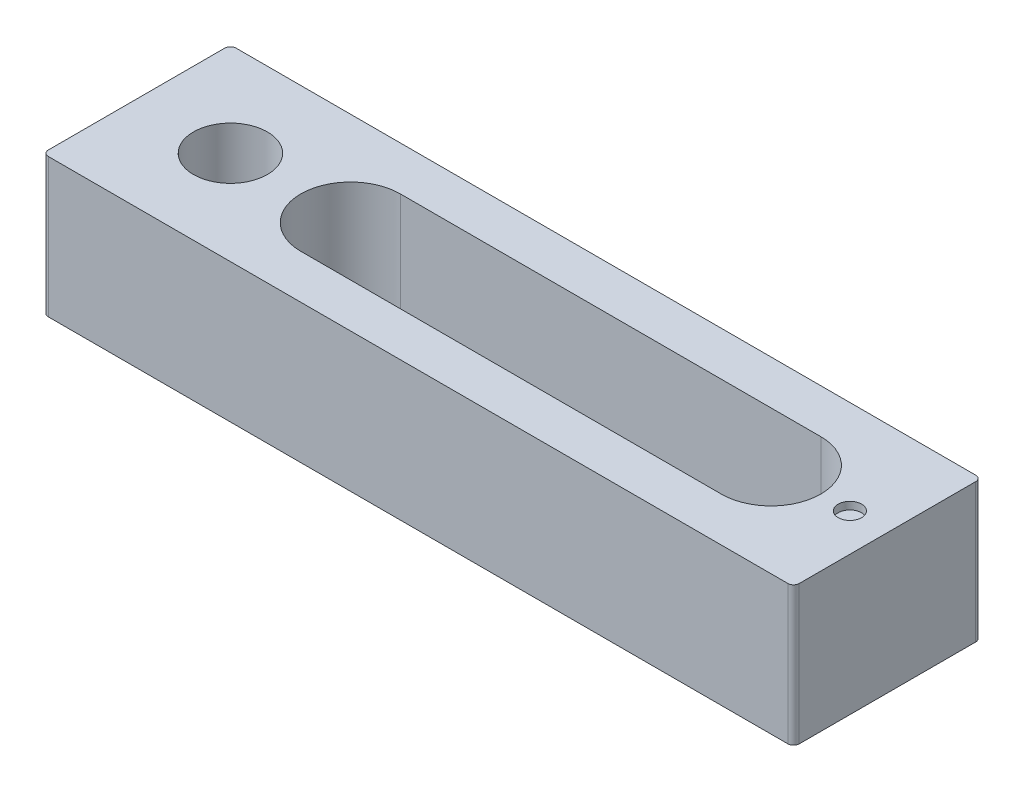
ISO-10303-21;
HEADER;
FILE_DESCRIPTION(('STEP AP214'),'2;1');
FILE_NAME('part.step','',(''),(''),'','','');
FILE_SCHEMA(('AUTOMOTIVE_DESIGN { 1 0 10303 214 1 1 1 1 }'));
ENDSEC;
DATA;
#1=APPLICATION_CONTEXT('core data for automotive mechanical design processes');
#2=APPLICATION_PROTOCOL_DEFINITION('international standard','automotive_design',2000,#1);
#3=PRODUCT_CONTEXT('',#1,'mechanical');
#4=PRODUCT('Part','Part','',(#3));
#5=PRODUCT_RELATED_PRODUCT_CATEGORY('part','',(#4));
#6=PRODUCT_DEFINITION_FORMATION('','',#4);
#7=PRODUCT_DEFINITION_CONTEXT('part definition',#1,'design');
#8=PRODUCT_DEFINITION('design','',#6,#7);
#9=PRODUCT_DEFINITION_SHAPE('','',#8);
#10=(LENGTH_UNIT() NAMED_UNIT(*) SI_UNIT(.MILLI.,.METRE.));
#11=(NAMED_UNIT(*) PLANE_ANGLE_UNIT() SI_UNIT($,.RADIAN.));
#12=(NAMED_UNIT(*) SI_UNIT($,.STERADIAN.) SOLID_ANGLE_UNIT());
#13=UNCERTAINTY_MEASURE_WITH_UNIT(LENGTH_MEASURE(1.E-05),#10,'distance_accuracy_value','');
#14=(GEOMETRIC_REPRESENTATION_CONTEXT(3) GLOBAL_UNCERTAINTY_ASSIGNED_CONTEXT((#13)) GLOBAL_UNIT_ASSIGNED_CONTEXT((#10,
#11,#12)) REPRESENTATION_CONTEXT('',''));
#15=CARTESIAN_POINT('',(0.,0.,0.));
#16=DIRECTION('',(0.,0.,1.));
#17=DIRECTION('',(1.,0.,0.));
#18=AXIS2_PLACEMENT_3D('',#15,#16,#17);
#19=CARTESIAN_POINT('',(-26.668802084728,5.51117500741104,-5.65020163902085));
#20=DIRECTION('',(0.,1.,0.));
#21=DIRECTION('',(0.,0.,1.));
#22=AXIS2_PLACEMENT_3D('',#19,#20,#21);
#23=PLANE('',#22);
#24=CARTESIAN_POINT('',(21.210197915272,5.51117500741104,0.318798360979145));
#25=DIRECTION('',(0.,1.,0.));
#26=DIRECTION('',(0.,0.,1.));
#27=AXIS2_PLACEMENT_3D('',#24,#25,#26);
#28=CIRCLE('',#27,0.793749999999999);
#29=CARTESIAN_POINT('',(21.210197915272,5.51117500741104,1.11254836097914));
#30=VERTEX_POINT('',#29);
#31=EDGE_CURVE('E291',#30,#30,#28,.T.);
#32=ORIENTED_EDGE('',*,*,#31,.F.);
#33=EDGE_LOOP('',(#32));
#34=FACE_BOUND('',#33,.T.);
#35=CARTESIAN_POINT('',(-20.699802084728,5.51117500741104,0.318798360979144));
#36=DIRECTION('',(0.,1.,0.));
#37=DIRECTION('',(0.,0.,1.));
#38=AXIS2_PLACEMENT_3D('',#35,#36,#37);
#39=CIRCLE('',#38,2.5);
#40=CARTESIAN_POINT('',(-20.699802084728,5.51117500741104,2.81879836097914));
#41=VERTEX_POINT('',#40);
#42=EDGE_CURVE('E133',#41,#41,#39,.T.);
#43=ORIENTED_EDGE('',*,*,#42,.F.);
#44=EDGE_LOOP('',(#43));
#45=FACE_BOUND('',#44,.T.);
#46=CARTESIAN_POINT('',(-26.668802084728,5.51117500741104,-5.65020163902085));
#47=DIRECTION('',(0.,1.,0.));
#48=DIRECTION('',(0.,0.,1.));
#49=AXIS2_PLACEMENT_3D('',#46,#47,#48);
#50=CIRCLE('',#49,0.381);
#51=CARTESIAN_POINT('',(-26.668802084728,5.51117500741104,-6.03120163902086));
#52=VERTEX_POINT('',#51);
#53=CARTESIAN_POINT('',(-27.049802084728,5.51117500741104,-5.65020163902085));
#54=VERTEX_POINT('',#53);
#55=EDGE_CURVE('E143',#52,#54,#50,.T.);
#56=ORIENTED_EDGE('',*,*,#55,.T.);
#57=DIRECTION('',(0.,0.,1.));
#58=VECTOR('',#57,1.);
#59=CARTESIAN_POINT('',(-27.049802084728,5.51117500741104,-5.65020163902085));
#60=LINE('',#59,#58);
#61=CARTESIAN_POINT('',(-27.049802084728,5.51117500741104,6.28779836097914));
#62=VERTEX_POINT('',#61);
#63=EDGE_CURVE('E146',#54,#62,#60,.T.);
#64=ORIENTED_EDGE('',*,*,#63,.T.);
#65=CARTESIAN_POINT('',(-26.668802084728,5.51117500741104,6.28779836097914));
#66=DIRECTION('',(0.,1.,0.));
#67=DIRECTION('',(0.,0.,1.));
#68=AXIS2_PLACEMENT_3D('',#65,#66,#67);
#69=CIRCLE('',#68,0.381);
#70=CARTESIAN_POINT('',(-26.668802084728,5.51117500741104,6.66879836097914));
#71=VERTEX_POINT('',#70);
#72=EDGE_CURVE('E149',#62,#71,#69,.T.);
#73=ORIENTED_EDGE('',*,*,#72,.T.);
#74=DIRECTION('',(1.,0.,0.));
#75=VECTOR('',#74,1.);
#76=CARTESIAN_POINT('',(-26.668802084728,5.51117500741104,6.66879836097914));
#77=LINE('',#76,#75);
#78=CARTESIAN_POINT('',(23.369197915272,5.51117500741104,6.66879836097914));
#79=VERTEX_POINT('',#78);
#80=EDGE_CURVE('E151',#71,#79,#77,.T.);
#81=ORIENTED_EDGE('',*,*,#80,.T.);
#82=CARTESIAN_POINT('',(23.369197915272,5.51117500741104,6.28779836097914));
#83=DIRECTION('',(0.,1.,0.));
#84=DIRECTION('',(0.,0.,1.));
#85=AXIS2_PLACEMENT_3D('',#82,#83,#84);
#86=CIRCLE('',#85,0.381);
#87=CARTESIAN_POINT('',(23.750197915272,5.51117500741104,6.28779836097914));
#88=VERTEX_POINT('',#87);
#89=EDGE_CURVE('E153',#79,#88,#86,.T.);
#90=ORIENTED_EDGE('',*,*,#89,.T.);
#91=DIRECTION('',(0.,0.,-1.));
#92=VECTOR('',#91,1.);
#93=CARTESIAN_POINT('',(23.750197915272,5.51117500741104,-5.65020163902085));
#94=LINE('',#93,#92);
#95=CARTESIAN_POINT('',(23.750197915272,5.51117500741104,-5.65020163902085));
#96=VERTEX_POINT('',#95);
#97=EDGE_CURVE('E155',#88,#96,#94,.T.);
#98=ORIENTED_EDGE('',*,*,#97,.T.);
#99=CARTESIAN_POINT('',(23.369197915272,5.51117500741104,-5.65020163902085));
#100=DIRECTION('',(0.,1.,0.));
#101=DIRECTION('',(0.,0.,-1.));
#102=AXIS2_PLACEMENT_3D('',#99,#100,#101);
#103=CIRCLE('',#102,0.381);
#104=CARTESIAN_POINT('',(23.369197915272,5.51117500741104,-6.03120163902085));
#105=VERTEX_POINT('',#104);
#106=EDGE_CURVE('E157',#96,#105,#103,.T.);
#107=ORIENTED_EDGE('',*,*,#106,.T.);
#108=DIRECTION('',(-1.,0.,0.));
#109=VECTOR('',#108,1.);
#110=CARTESIAN_POINT('',(-26.668802084728,5.51117500741104,-6.03120163902086));
#111=LINE('',#110,#109);
#112=EDGE_CURVE('E159',#105,#52,#111,.T.);
#113=ORIENTED_EDGE('',*,*,#112,.T.);
#114=EDGE_LOOP('',(#56,#64,#73,#81,#90,#98,#107,#113));
#115=FACE_BOUND('',#114,.T.);
#116=DIRECTION('',(1.,0.,0.));
#117=VECTOR('',#116,1.);
#118=CARTESIAN_POINT('',(-12.571802084728,5.51117500741104,3.68429836097914));
#119=LINE('',#118,#117);
#120=CARTESIAN_POINT('',(-12.571802084728,5.51117500741104,3.68429836097914));
#121=VERTEX_POINT('',#120);
#122=CARTESIAN_POINT('',(15.876197915272,5.51117500741104,3.68429836097914));
#123=VERTEX_POINT('',#122);
#124=EDGE_CURVE('E113',#121,#123,#119,.T.);
#125=ORIENTED_EDGE('',*,*,#124,.F.);
#126=CARTESIAN_POINT('',(-12.571802084728,5.51117500741104,0.318798360979144));
#127=DIRECTION('',(0.,1.,0.));
#128=DIRECTION('',(0.,0.,1.));
#129=AXIS2_PLACEMENT_3D('',#126,#127,#128);
#130=CIRCLE('',#129,3.3655);
#131=CARTESIAN_POINT('',(-12.571802084728,5.51117500741104,-3.04670163902086));
#132=VERTEX_POINT('',#131);
#133=EDGE_CURVE('E105',#132,#121,#130,.T.);
#134=ORIENTED_EDGE('',*,*,#133,.F.);
#135=DIRECTION('',(-1.,0.,0.));
#136=VECTOR('',#135,1.);
#137=CARTESIAN_POINT('',(-12.571802084728,5.51117500741104,-3.04670163902086));
#138=LINE('',#137,#136);
#139=CARTESIAN_POINT('',(15.876197915272,5.51117500741104,-3.04670163902086));
#140=VERTEX_POINT('',#139);
#141=EDGE_CURVE('E127',#140,#132,#138,.T.);
#142=ORIENTED_EDGE('',*,*,#141,.F.);
#143=CARTESIAN_POINT('',(15.876197915272,5.51117500741104,0.318798360979144));
#144=DIRECTION('',(0.,1.,0.));
#145=DIRECTION('',(0.,0.,1.));
#146=AXIS2_PLACEMENT_3D('',#143,#144,#145);
#147=CIRCLE('',#146,3.3655);
#148=EDGE_CURVE('E125',#123,#140,#147,.T.);
#149=ORIENTED_EDGE('',*,*,#148,.F.);
#150=EDGE_LOOP('',(#125,#134,#142,#149));
#151=FACE_BOUND('',#150,.T.);
#152=ADVANCED_FACE('F16',(#34,#45,#115,#151),#23,.T.);
#153=CARTESIAN_POINT('',(-26.668802084728,-3.88682499258896,-5.65020163902085));
#154=DIRECTION('',(0.,1.,0.));
#155=DIRECTION('',(0.,0.,1.));
#156=AXIS2_PLACEMENT_3D('',#153,#154,#155);
#157=PLANE('',#156);
#158=CARTESIAN_POINT('',(-20.699802084728,-3.88682499258896,0.318798360979144));
#159=DIRECTION('',(0.,1.,0.));
#160=DIRECTION('',(0.,0.,1.));
#161=AXIS2_PLACEMENT_3D('',#158,#159,#160);
#162=CIRCLE('',#161,2.5);
#163=CARTESIAN_POINT('',(-20.699802084728,-3.88682499258896,2.81879836097914));
#164=VERTEX_POINT('',#163);
#165=EDGE_CURVE('E290',#164,#164,#162,.T.);
#166=ORIENTED_EDGE('',*,*,#165,.T.);
#167=EDGE_LOOP('',(#166));
#168=FACE_BOUND('',#167,.T.);
#169=CARTESIAN_POINT('',(-26.668802084728,-3.88682499258896,-5.65020163902085));
#170=DIRECTION('',(0.,1.,0.));
#171=DIRECTION('',(0.,0.,1.));
#172=AXIS2_PLACEMENT_3D('',#169,#170,#171);
#173=CIRCLE('',#172,0.381);
#174=CARTESIAN_POINT('',(-26.668802084728,-3.88682499258896,-6.03120163902086));
#175=VERTEX_POINT('',#174);
#176=CARTESIAN_POINT('',(-27.049802084728,-3.88682499258896,-5.65020163902085));
#177=VERTEX_POINT('',#176);
#178=EDGE_CURVE('E121',#175,#177,#173,.T.);
#179=ORIENTED_EDGE('',*,*,#178,.F.);
#180=DIRECTION('',(-1.,0.,0.));
#181=VECTOR('',#180,1.);
#182=CARTESIAN_POINT('',(-26.668802084728,-3.88682499258896,-6.03120163902086));
#183=LINE('',#182,#181);
#184=CARTESIAN_POINT('',(23.369197915272,-3.88682499258896,-6.03120163902085));
#185=VERTEX_POINT('',#184);
#186=EDGE_CURVE('E147',#185,#175,#183,.T.);
#187=ORIENTED_EDGE('',*,*,#186,.F.);
#188=CARTESIAN_POINT('',(23.369197915272,-3.88682499258896,-5.65020163902085));
#189=DIRECTION('',(0.,1.,0.));
#190=DIRECTION('',(0.,0.,-1.));
#191=AXIS2_PLACEMENT_3D('',#188,#189,#190);
#192=CIRCLE('',#191,0.381);
#193=CARTESIAN_POINT('',(23.750197915272,-3.88682499258896,-5.65020163902085));
#194=VERTEX_POINT('',#193);
#195=EDGE_CURVE('E174',#194,#185,#192,.T.);
#196=ORIENTED_EDGE('',*,*,#195,.F.);
#197=DIRECTION('',(0.,0.,-1.));
#198=VECTOR('',#197,1.);
#199=CARTESIAN_POINT('',(23.750197915272,-3.88682499258896,-5.65020163902085));
#200=LINE('',#199,#198);
#201=CARTESIAN_POINT('',(23.750197915272,-3.88682499258896,6.28779836097914));
#202=VERTEX_POINT('',#201);
#203=EDGE_CURVE('E172',#202,#194,#200,.T.);
#204=ORIENTED_EDGE('',*,*,#203,.F.);
#205=CARTESIAN_POINT('',(23.369197915272,-3.88682499258896,6.28779836097914));
#206=DIRECTION('',(0.,1.,0.));
#207=DIRECTION('',(0.,0.,1.));
#208=AXIS2_PLACEMENT_3D('',#205,#206,#207);
#209=CIRCLE('',#208,0.381);
#210=CARTESIAN_POINT('',(23.369197915272,-3.88682499258896,6.66879836097914));
#211=VERTEX_POINT('',#210);
#212=EDGE_CURVE('E170',#211,#202,#209,.T.);
#213=ORIENTED_EDGE('',*,*,#212,.F.);
#214=DIRECTION('',(1.,0.,0.));
#215=VECTOR('',#214,1.);
#216=CARTESIAN_POINT('',(-26.668802084728,-3.88682499258896,6.66879836097914));
#217=LINE('',#216,#215);
#218=CARTESIAN_POINT('',(-26.668802084728,-3.88682499258896,6.66879836097914));
#219=VERTEX_POINT('',#218);
#220=EDGE_CURVE('E168',#219,#211,#217,.T.);
#221=ORIENTED_EDGE('',*,*,#220,.F.);
#222=CARTESIAN_POINT('',(-26.668802084728,-3.88682499258896,6.28779836097914));
#223=DIRECTION('',(0.,1.,0.));
#224=DIRECTION('',(0.,0.,1.));
#225=AXIS2_PLACEMENT_3D('',#222,#223,#224);
#226=CIRCLE('',#225,0.381);
#227=CARTESIAN_POINT('',(-27.049802084728,-3.88682499258896,6.28779836097914));
#228=VERTEX_POINT('',#227);
#229=EDGE_CURVE('E166',#228,#219,#226,.T.);
#230=ORIENTED_EDGE('',*,*,#229,.F.);
#231=DIRECTION('',(0.,0.,1.));
#232=VECTOR('',#231,1.);
#233=CARTESIAN_POINT('',(-27.049802084728,-3.88682499258896,-5.65020163902085));
#234=LINE('',#233,#232);
#235=EDGE_CURVE('E164',#177,#228,#234,.T.);
#236=ORIENTED_EDGE('',*,*,#235,.F.);
#237=EDGE_LOOP('',(#179,#187,#196,#204,#213,#221,#230,#236));
#238=FACE_BOUND('',#237,.T.);
#239=CARTESIAN_POINT('',(-12.571802084728,-3.88682499258896,0.318798360979144));
#240=DIRECTION('',(0.,1.,0.));
#241=DIRECTION('',(0.,0.,1.));
#242=AXIS2_PLACEMENT_3D('',#239,#240,#241);
#243=CIRCLE('',#242,3.3655);
#244=CARTESIAN_POINT('',(-12.571802084728,-3.88682499258896,-3.04670163902086));
#245=VERTEX_POINT('',#244);
#246=CARTESIAN_POINT('',(-12.571802084728,-3.88682499258896,3.68429836097914));
#247=VERTEX_POINT('',#246);
#248=EDGE_CURVE('E39',#245,#247,#243,.T.);
#249=ORIENTED_EDGE('',*,*,#248,.T.);
#250=DIRECTION('',(1.,0.,0.));
#251=VECTOR('',#250,1.);
#252=CARTESIAN_POINT('',(-12.571802084728,-3.88682499258896,3.68429836097914));
#253=LINE('',#252,#251);
#254=CARTESIAN_POINT('',(15.876197915272,-3.88682499258896,3.68429836097914));
#255=VERTEX_POINT('',#254);
#256=EDGE_CURVE('E120',#247,#255,#253,.T.);
#257=ORIENTED_EDGE('',*,*,#256,.T.);
#258=CARTESIAN_POINT('',(15.876197915272,-3.88682499258896,0.318798360979144));
#259=DIRECTION('',(0.,1.,0.));
#260=DIRECTION('',(0.,0.,1.));
#261=AXIS2_PLACEMENT_3D('',#258,#259,#260);
#262=CIRCLE('',#261,3.3655);
#263=CARTESIAN_POINT('',(15.876197915272,-3.88682499258896,-3.04670163902086));
#264=VERTEX_POINT('',#263);
#265=EDGE_CURVE('E135',#255,#264,#262,.T.);
#266=ORIENTED_EDGE('',*,*,#265,.T.);
#267=DIRECTION('',(-1.,0.,0.));
#268=VECTOR('',#267,1.);
#269=CARTESIAN_POINT('',(-12.571802084728,-3.88682499258896,-3.04670163902086));
#270=LINE('',#269,#268);
#271=EDGE_CURVE('E114',#264,#245,#270,.T.);
#272=ORIENTED_EDGE('',*,*,#271,.T.);
#273=EDGE_LOOP('',(#249,#257,#266,#272));
#274=FACE_BOUND('',#273,.T.);
#275=ADVANCED_FACE('F204',(#168,#238,#274),#157,.F.);
#276=CARTESIAN_POINT('',(-26.668802084728,5.51117500741104,-5.65020163902085));
#277=DIRECTION('',(0.,-1.,0.));
#278=DIRECTION('',(0.,0.,-1.));
#279=AXIS2_PLACEMENT_3D('',#276,#277,#278);
#280=CYLINDRICAL_SURFACE('',#279,0.381);
#281=ORIENTED_EDGE('',*,*,#178,.T.);
#282=DIRECTION('',(0.,-1.,0.));
#283=VECTOR('',#282,1.);
#284=CARTESIAN_POINT('',(-27.049802084728,5.51117500741104,-5.65020163902085));
#285=LINE('',#284,#283);
#286=EDGE_CURVE('E10',#54,#177,#285,.T.);
#287=ORIENTED_EDGE('',*,*,#286,.F.);
#288=ORIENTED_EDGE('',*,*,#55,.F.);
#289=DIRECTION('',(0.,-1.,0.));
#290=VECTOR('',#289,1.);
#291=CARTESIAN_POINT('',(-26.668802084728,5.51117500741104,-6.03120163902086));
#292=LINE('',#291,#290);
#293=EDGE_CURVE('E161',#52,#175,#292,.T.);
#294=ORIENTED_EDGE('',*,*,#293,.T.);
#295=EDGE_LOOP('',(#281,#287,#288,#294));
#296=FACE_BOUND('',#295,.T.);
#297=ADVANCED_FACE('F18',(#296),#280,.T.);
#298=CARTESIAN_POINT('',(-27.049802084728,5.51117500741104,-5.65020163902085));
#299=DIRECTION('',(1.,0.,0.));
#300=DIRECTION('',(0.,0.,-1.));
#301=AXIS2_PLACEMENT_3D('',#298,#299,#300);
#302=PLANE('',#301);
#303=ORIENTED_EDGE('',*,*,#235,.T.);
#304=DIRECTION('',(0.,-1.,0.));
#305=VECTOR('',#304,1.);
#306=CARTESIAN_POINT('',(-27.049802084728,5.51117500741104,6.28779836097914));
#307=LINE('',#306,#305);
#308=EDGE_CURVE('E24',#62,#228,#307,.T.);
#309=ORIENTED_EDGE('',*,*,#308,.F.);
#310=ORIENTED_EDGE('',*,*,#63,.F.);
#311=ORIENTED_EDGE('',*,*,#286,.T.);
#312=EDGE_LOOP('',(#303,#309,#310,#311));
#313=FACE_BOUND('',#312,.T.);
#314=ADVANCED_FACE('F221',(#313),#302,.F.);
#315=CARTESIAN_POINT('',(-26.668802084728,5.51117500741104,6.28779836097914));
#316=DIRECTION('',(0.,-1.,0.));
#317=DIRECTION('',(0.,0.,-1.));
#318=AXIS2_PLACEMENT_3D('',#315,#316,#317);
#319=CYLINDRICAL_SURFACE('',#318,0.381);
#320=ORIENTED_EDGE('',*,*,#229,.T.);
#321=DIRECTION('',(0.,-1.,0.));
#322=VECTOR('',#321,1.);
#323=CARTESIAN_POINT('',(-26.668802084728,5.51117500741104,6.66879836097914));
#324=LINE('',#323,#322);
#325=EDGE_CURVE('E191',#71,#219,#324,.T.);
#326=ORIENTED_EDGE('',*,*,#325,.F.);
#327=ORIENTED_EDGE('',*,*,#72,.F.);
#328=ORIENTED_EDGE('',*,*,#308,.T.);
#329=EDGE_LOOP('',(#320,#326,#327,#328));
#330=FACE_BOUND('',#329,.T.);
#331=ADVANCED_FACE('F198',(#330),#319,.T.);
#332=CARTESIAN_POINT('',(-26.668802084728,5.51117500741104,6.66879836097914));
#333=DIRECTION('',(0.,0.,-1.));
#334=DIRECTION('',(-1.,0.,0.));
#335=AXIS2_PLACEMENT_3D('',#332,#333,#334);
#336=PLANE('',#335);
#337=ORIENTED_EDGE('',*,*,#220,.T.);
#338=DIRECTION('',(0.,-1.,0.));
#339=VECTOR('',#338,1.);
#340=CARTESIAN_POINT('',(23.369197915272,5.51117500741104,6.66879836097914));
#341=LINE('',#340,#339);
#342=EDGE_CURVE('E188',#79,#211,#341,.T.);
#343=ORIENTED_EDGE('',*,*,#342,.F.);
#344=ORIENTED_EDGE('',*,*,#80,.F.);
#345=ORIENTED_EDGE('',*,*,#325,.T.);
#346=EDGE_LOOP('',(#337,#343,#344,#345));
#347=FACE_BOUND('',#346,.T.);
#348=ADVANCED_FACE('F210',(#347),#336,.F.);
#349=CARTESIAN_POINT('',(23.369197915272,5.51117500741104,6.28779836097914));
#350=DIRECTION('',(0.,-1.,0.));
#351=DIRECTION('',(0.,0.,-1.));
#352=AXIS2_PLACEMENT_3D('',#349,#350,#351);
#353=CYLINDRICAL_SURFACE('',#352,0.381);
#354=ORIENTED_EDGE('',*,*,#212,.T.);
#355=DIRECTION('',(0.,-1.,0.));
#356=VECTOR('',#355,1.);
#357=CARTESIAN_POINT('',(23.750197915272,5.51117500741104,6.28779836097914));
#358=LINE('',#357,#356);
#359=EDGE_CURVE('E185',#88,#202,#358,.T.);
#360=ORIENTED_EDGE('',*,*,#359,.F.);
#361=ORIENTED_EDGE('',*,*,#89,.F.);
#362=ORIENTED_EDGE('',*,*,#342,.T.);
#363=EDGE_LOOP('',(#354,#360,#361,#362));
#364=FACE_BOUND('',#363,.T.);
#365=ADVANCED_FACE('F214',(#364),#353,.T.);
#366=CARTESIAN_POINT('',(23.750197915272,5.51117500741104,-5.65020163902085));
#367=DIRECTION('',(-1.,0.,0.));
#368=DIRECTION('',(0.,0.,1.));
#369=AXIS2_PLACEMENT_3D('',#366,#367,#368);
#370=PLANE('',#369);
#371=ORIENTED_EDGE('',*,*,#203,.T.);
#372=DIRECTION('',(0.,-1.,0.));
#373=VECTOR('',#372,1.);
#374=CARTESIAN_POINT('',(23.750197915272,5.51117500741104,-5.65020163902085));
#375=LINE('',#374,#373);
#376=EDGE_CURVE('E182',#96,#194,#375,.T.);
#377=ORIENTED_EDGE('',*,*,#376,.F.);
#378=ORIENTED_EDGE('',*,*,#97,.F.);
#379=ORIENTED_EDGE('',*,*,#359,.T.);
#380=EDGE_LOOP('',(#371,#377,#378,#379));
#381=FACE_BOUND('',#380,.T.);
#382=ADVANCED_FACE('F234',(#381),#370,.F.);
#383=CARTESIAN_POINT('',(23.369197915272,5.51117500741104,-5.65020163902085));
#384=DIRECTION('',(0.,-1.,0.));
#385=DIRECTION('',(0.,0.,-1.));
#386=AXIS2_PLACEMENT_3D('',#383,#384,#385);
#387=CYLINDRICAL_SURFACE('',#386,0.381);
#388=ORIENTED_EDGE('',*,*,#195,.T.);
#389=DIRECTION('',(0.,-1.,0.));
#390=VECTOR('',#389,1.);
#391=CARTESIAN_POINT('',(23.369197915272,5.51117500741104,-6.03120163902085));
#392=LINE('',#391,#390);
#393=EDGE_CURVE('E179',#105,#185,#392,.T.);
#394=ORIENTED_EDGE('',*,*,#393,.F.);
#395=ORIENTED_EDGE('',*,*,#106,.F.);
#396=ORIENTED_EDGE('',*,*,#376,.T.);
#397=EDGE_LOOP('',(#388,#394,#395,#396));
#398=FACE_BOUND('',#397,.T.);
#399=ADVANCED_FACE('F232',(#398),#387,.T.);
#400=CARTESIAN_POINT('',(-26.668802084728,5.51117500741104,-6.03120163902086));
#401=DIRECTION('',(0.,0.,1.));
#402=DIRECTION('',(1.,0.,0.));
#403=AXIS2_PLACEMENT_3D('',#400,#401,#402);
#404=PLANE('',#403);
#405=ORIENTED_EDGE('',*,*,#186,.T.);
#406=ORIENTED_EDGE('',*,*,#293,.F.);
#407=ORIENTED_EDGE('',*,*,#112,.F.);
#408=ORIENTED_EDGE('',*,*,#393,.T.);
#409=EDGE_LOOP('',(#405,#406,#407,#408));
#410=FACE_BOUND('',#409,.T.);
#411=ADVANCED_FACE('F227',(#410),#404,.F.);
#412=CARTESIAN_POINT('',(-12.571802084728,5.51117500741104,0.318798360979144));
#413=DIRECTION('',(0.,-1.,0.));
#414=DIRECTION('',(0.,0.,-1.));
#415=AXIS2_PLACEMENT_3D('',#412,#413,#414);
#416=CYLINDRICAL_SURFACE('',#415,3.3655);
#417=ORIENTED_EDGE('',*,*,#248,.F.);
#418=DIRECTION('',(0.,-1.,0.));
#419=VECTOR('',#418,1.);
#420=CARTESIAN_POINT('',(-12.571802084728,5.51117500741104,-3.04670163902086));
#421=LINE('',#420,#419);
#422=EDGE_CURVE('E109',#132,#245,#421,.T.);
#423=ORIENTED_EDGE('',*,*,#422,.F.);
#424=ORIENTED_EDGE('',*,*,#133,.T.);
#425=DIRECTION('',(0.,-1.,0.));
#426=VECTOR('',#425,1.);
#427=CARTESIAN_POINT('',(-12.571802084728,5.51117500741104,3.68429836097914));
#428=LINE('',#427,#426);
#429=EDGE_CURVE('E108',#121,#247,#428,.T.);
#430=ORIENTED_EDGE('',*,*,#429,.T.);
#431=EDGE_LOOP('',(#417,#423,#424,#430));
#432=FACE_BOUND('',#431,.T.);
#433=ADVANCED_FACE('F107',(#432),#416,.F.);
#434=CARTESIAN_POINT('',(-12.571802084728,5.51117500741104,3.68429836097914));
#435=DIRECTION('',(0.,0.,-1.));
#436=DIRECTION('',(-1.,0.,0.));
#437=AXIS2_PLACEMENT_3D('',#434,#435,#436);
#438=PLANE('',#437);
#439=ORIENTED_EDGE('',*,*,#256,.F.);
#440=ORIENTED_EDGE('',*,*,#429,.F.);
#441=ORIENTED_EDGE('',*,*,#124,.T.);
#442=DIRECTION('',(0.,-1.,0.));
#443=VECTOR('',#442,1.);
#444=CARTESIAN_POINT('',(15.876197915272,5.51117500741104,3.68429836097914));
#445=LINE('',#444,#443);
#446=EDGE_CURVE('E122',#123,#255,#445,.T.);
#447=ORIENTED_EDGE('',*,*,#446,.T.);
#448=EDGE_LOOP('',(#439,#440,#441,#447));
#449=FACE_BOUND('',#448,.T.);
#450=ADVANCED_FACE('F117',(#449),#438,.T.);
#451=CARTESIAN_POINT('',(15.876197915272,5.51117500741104,0.318798360979144));
#452=DIRECTION('',(0.,-1.,0.));
#453=DIRECTION('',(0.,0.,-1.));
#454=AXIS2_PLACEMENT_3D('',#451,#452,#453);
#455=CYLINDRICAL_SURFACE('',#454,3.3655);
#456=ORIENTED_EDGE('',*,*,#265,.F.);
#457=ORIENTED_EDGE('',*,*,#446,.F.);
#458=ORIENTED_EDGE('',*,*,#148,.T.);
#459=DIRECTION('',(0.,-1.,0.));
#460=VECTOR('',#459,1.);
#461=CARTESIAN_POINT('',(15.876197915272,5.51117500741104,-3.04670163902086));
#462=LINE('',#461,#460);
#463=EDGE_CURVE('E31',#140,#264,#462,.T.);
#464=ORIENTED_EDGE('',*,*,#463,.T.);
#465=EDGE_LOOP('',(#456,#457,#458,#464));
#466=FACE_BOUND('',#465,.T.);
#467=ADVANCED_FACE('F264',(#466),#455,.F.);
#468=CARTESIAN_POINT('',(-12.571802084728,5.51117500741104,-3.04670163902086));
#469=DIRECTION('',(0.,0.,1.));
#470=DIRECTION('',(1.,0.,0.));
#471=AXIS2_PLACEMENT_3D('',#468,#469,#470);
#472=PLANE('',#471);
#473=ORIENTED_EDGE('',*,*,#271,.F.);
#474=ORIENTED_EDGE('',*,*,#463,.F.);
#475=ORIENTED_EDGE('',*,*,#141,.T.);
#476=ORIENTED_EDGE('',*,*,#422,.T.);
#477=EDGE_LOOP('',(#473,#474,#475,#476));
#478=FACE_BOUND('',#477,.T.);
#479=ADVANCED_FACE('F268',(#478),#472,.T.);
#480=CARTESIAN_POINT('',(-20.699802084728,5.51117500741104,0.318798360979144));
#481=DIRECTION('',(0.,1.,0.));
#482=DIRECTION('',(0.,0.,1.));
#483=AXIS2_PLACEMENT_3D('',#480,#481,#482);
#484=CYLINDRICAL_SURFACE('',#483,2.5);
#485=ORIENTED_EDGE('',*,*,#165,.F.);
#486=EDGE_LOOP('',(#485));
#487=FACE_BOUND('',#486,.T.);
#488=ORIENTED_EDGE('',*,*,#42,.T.);
#489=EDGE_LOOP('',(#488));
#490=FACE_BOUND('',#489,.T.);
#491=ADVANCED_FACE('F274',(#487,#490),#484,.F.);
#492=CARTESIAN_POINT('',(21.210197915272,5.00317500741104,0.318798360979145));
#493=DIRECTION('',(0.,1.,0.));
#494=DIRECTION('',(0.,0.,1.));
#495=AXIS2_PLACEMENT_3D('',#492,#493,#494);
#496=CYLINDRICAL_SURFACE('',#495,0.793749999999999);
#497=CARTESIAN_POINT('',(21.210197915272,5.00317500741104,0.318798360979145));
#498=DIRECTION('',(0.,1.,0.));
#499=DIRECTION('',(0.,0.,1.));
#500=AXIS2_PLACEMENT_3D('',#497,#498,#499);
#501=CIRCLE('',#500,0.793749999999999);
#502=CARTESIAN_POINT('',(21.210197915272,5.00317500741104,1.11254836097914));
#503=VERTEX_POINT('',#502);
#504=EDGE_CURVE('E289',#503,#503,#501,.T.);
#505=ORIENTED_EDGE('',*,*,#504,.F.);
#506=EDGE_LOOP('',(#505));
#507=FACE_BOUND('',#506,.T.);
#508=ORIENTED_EDGE('',*,*,#31,.T.);
#509=EDGE_LOOP('',(#508));
#510=FACE_BOUND('',#509,.T.);
#511=ADVANCED_FACE('F277',(#507,#510),#496,.F.);
#512=CARTESIAN_POINT('',(21.210197915272,5.00317500741104,0.318798360979145));
#513=DIRECTION('',(0.,1.,0.));
#514=DIRECTION('',(0.,0.,1.));
#515=AXIS2_PLACEMENT_3D('',#512,#513,#514);
#516=PLANE('',#515);
#517=ORIENTED_EDGE('',*,*,#504,.T.);
#518=EDGE_LOOP('',(#517));
#519=FACE_BOUND('',#518,.T.);
#520=ADVANCED_FACE('F281',(#519),#516,.T.);
#521=CLOSED_SHELL('',(#152,#275,#297,#314,#331,#348,#365,#382,#399,#411,#433,#450,#467,#479,
#491,#511,#520));
#522=MANIFOLD_SOLID_BREP('B1',#521);
#523=ADVANCED_BREP_SHAPE_REPRESENTATION('',(#18,#522),#14);
#524=SHAPE_DEFINITION_REPRESENTATION(#9,#523);
ENDSEC;
END-ISO-10303-21;
